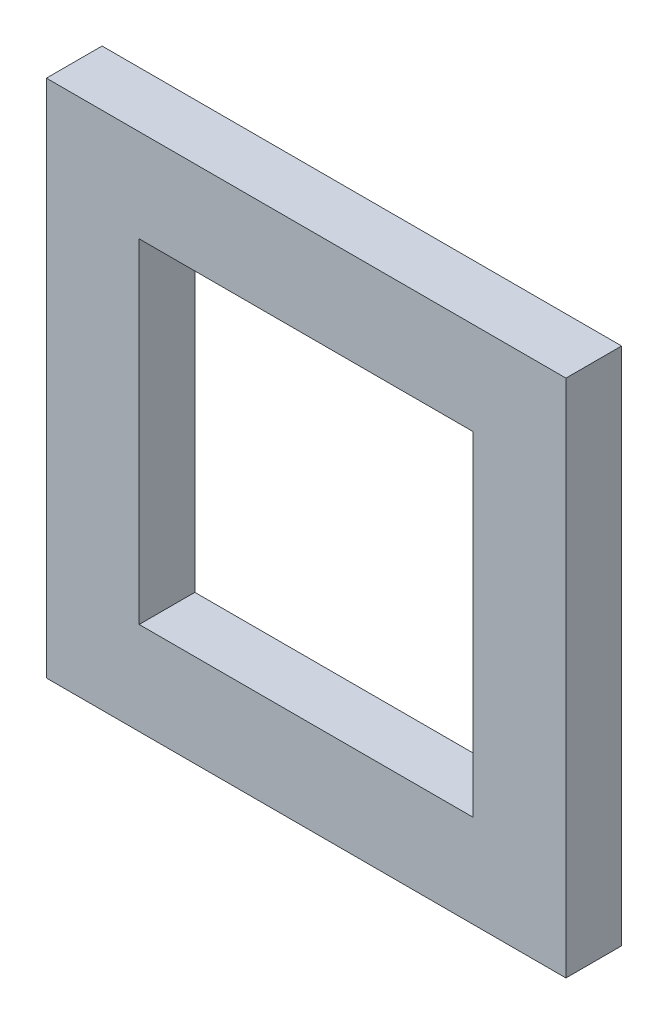
ISO-10303-21;
HEADER;
FILE_DESCRIPTION(('STEP AP214'),'2;1');
FILE_NAME('part.step','',(''),(''),'','','');
FILE_SCHEMA(('AUTOMOTIVE_DESIGN { 1 0 10303 214 1 1 1 1 }'));
ENDSEC;
DATA;
#1=APPLICATION_CONTEXT('core data for automotive mechanical design processes');
#2=APPLICATION_PROTOCOL_DEFINITION('international standard','automotive_design',2000,#1);
#3=PRODUCT_CONTEXT('',#1,'mechanical');
#4=PRODUCT('Part','Part','',(#3));
#5=PRODUCT_RELATED_PRODUCT_CATEGORY('part','',(#4));
#6=PRODUCT_DEFINITION_FORMATION('','',#4);
#7=PRODUCT_DEFINITION_CONTEXT('part definition',#1,'design');
#8=PRODUCT_DEFINITION('design','',#6,#7);
#9=PRODUCT_DEFINITION_SHAPE('','',#8);
#10=(LENGTH_UNIT() NAMED_UNIT(*) SI_UNIT(.MILLI.,.METRE.));
#11=(NAMED_UNIT(*) PLANE_ANGLE_UNIT() SI_UNIT($,.RADIAN.));
#12=(NAMED_UNIT(*) SI_UNIT($,.STERADIAN.) SOLID_ANGLE_UNIT());
#13=UNCERTAINTY_MEASURE_WITH_UNIT(LENGTH_MEASURE(1.E-05),#10,'distance_accuracy_value','');
#14=(GEOMETRIC_REPRESENTATION_CONTEXT(3) GLOBAL_UNCERTAINTY_ASSIGNED_CONTEXT((#13)) GLOBAL_UNIT_ASSIGNED_CONTEXT((#10,
#11,#12)) REPRESENTATION_CONTEXT('',''));
#15=CARTESIAN_POINT('',(0.,0.,0.));
#16=DIRECTION('',(0.,0.,1.));
#17=DIRECTION('',(1.,0.,0.));
#18=AXIS2_PLACEMENT_3D('',#15,#16,#17);
#19=CARTESIAN_POINT('',(0.,0.,3.));
#20=DIRECTION('',(0.,0.,-1.));
#21=DIRECTION('',(-1.,0.,0.));
#22=AXIS2_PLACEMENT_3D('',#19,#20,#21);
#23=PLANE('',#22);
#24=DIRECTION('',(0.,-1.,0.));
#25=VECTOR('',#24,1.);
#26=CARTESIAN_POINT('',(0.,0.,3.));
#27=LINE('',#26,#25);
#28=CARTESIAN_POINT('',(0.,28.,3.));
#29=VERTEX_POINT('',#28);
#30=CARTESIAN_POINT('',(0.,0.,3.));
#31=VERTEX_POINT('',#30);
#32=EDGE_CURVE('E143',#29,#31,#27,.T.);
#33=ORIENTED_EDGE('',*,*,#32,.T.);
#34=DIRECTION('',(1.,0.,0.));
#35=VECTOR('',#34,1.);
#36=CARTESIAN_POINT('',(0.,0.,3.));
#37=LINE('',#36,#35);
#38=CARTESIAN_POINT('',(28.,0.,3.));
#39=VERTEX_POINT('',#38);
#40=EDGE_CURVE('E150',#31,#39,#37,.T.);
#41=ORIENTED_EDGE('',*,*,#40,.T.);
#42=DIRECTION('',(0.,1.,0.));
#43=VECTOR('',#42,1.);
#44=CARTESIAN_POINT('',(28.,0.,3.));
#45=LINE('',#44,#43);
#46=CARTESIAN_POINT('',(28.,28.,3.));
#47=VERTEX_POINT('',#46);
#48=EDGE_CURVE('E148',#39,#47,#45,.T.);
#49=ORIENTED_EDGE('',*,*,#48,.T.);
#50=DIRECTION('',(-1.,0.,0.));
#51=VECTOR('',#50,1.);
#52=CARTESIAN_POINT('',(0.,28.,3.));
#53=LINE('',#52,#51);
#54=EDGE_CURVE('E155',#47,#29,#53,.T.);
#55=ORIENTED_EDGE('',*,*,#54,.T.);
#56=EDGE_LOOP('',(#33,#41,#49,#55));
#57=FACE_BOUND('',#56,.T.);
#58=DIRECTION('',(0.,-1.,0.));
#59=VECTOR('',#58,1.);
#60=CARTESIAN_POINT('',(5.,5.,3.));
#61=LINE('',#60,#59);
#62=CARTESIAN_POINT('',(5.,23.,3.));
#63=VERTEX_POINT('',#62);
#64=CARTESIAN_POINT('',(5.,5.,3.));
#65=VERTEX_POINT('',#64);
#66=EDGE_CURVE('E106',#63,#65,#61,.T.);
#67=ORIENTED_EDGE('',*,*,#66,.F.);
#68=DIRECTION('',(-1.,0.,0.));
#69=VECTOR('',#68,1.);
#70=CARTESIAN_POINT('',(5.,23.,3.));
#71=LINE('',#70,#69);
#72=CARTESIAN_POINT('',(23.,23.,3.));
#73=VERTEX_POINT('',#72);
#74=EDGE_CURVE('E127',#73,#63,#71,.T.);
#75=ORIENTED_EDGE('',*,*,#74,.F.);
#76=DIRECTION('',(0.,1.,0.));
#77=VECTOR('',#76,1.);
#78=CARTESIAN_POINT('',(23.,5.,3.));
#79=LINE('',#78,#77);
#80=CARTESIAN_POINT('',(23.,5.,3.));
#81=VERTEX_POINT('',#80);
#82=EDGE_CURVE('E126',#81,#73,#79,.T.);
#83=ORIENTED_EDGE('',*,*,#82,.F.);
#84=DIRECTION('',(1.,0.,0.));
#85=VECTOR('',#84,1.);
#86=CARTESIAN_POINT('',(5.,5.,3.));
#87=LINE('',#86,#85);
#88=EDGE_CURVE('E118',#65,#81,#87,.T.);
#89=ORIENTED_EDGE('',*,*,#88,.F.);
#90=EDGE_LOOP('',(#67,#75,#83,#89));
#91=FACE_BOUND('',#90,.T.);
#92=ADVANCED_FACE('F43',(#57,#91),#23,.F.);
#93=CARTESIAN_POINT('',(0.,0.,0.));
#94=DIRECTION('',(0.,0.,-1.));
#95=DIRECTION('',(-1.,0.,0.));
#96=AXIS2_PLACEMENT_3D('',#93,#94,#95);
#97=PLANE('',#96);
#98=DIRECTION('',(0.,-1.,0.));
#99=VECTOR('',#98,1.);
#100=CARTESIAN_POINT('',(0.,0.,0.));
#101=LINE('',#100,#99);
#102=CARTESIAN_POINT('',(0.,28.,0.));
#103=VERTEX_POINT('',#102);
#104=CARTESIAN_POINT('',(0.,0.,0.));
#105=VERTEX_POINT('',#104);
#106=EDGE_CURVE('E125',#103,#105,#101,.T.);
#107=ORIENTED_EDGE('',*,*,#106,.F.);
#108=DIRECTION('',(-1.,0.,0.));
#109=VECTOR('',#108,1.);
#110=CARTESIAN_POINT('',(0.,28.,0.));
#111=LINE('',#110,#109);
#112=CARTESIAN_POINT('',(28.,28.,0.));
#113=VERTEX_POINT('',#112);
#114=EDGE_CURVE('E149',#113,#103,#111,.T.);
#115=ORIENTED_EDGE('',*,*,#114,.F.);
#116=DIRECTION('',(0.,1.,0.));
#117=VECTOR('',#116,1.);
#118=CARTESIAN_POINT('',(28.,0.,0.));
#119=LINE('',#118,#117);
#120=CARTESIAN_POINT('',(28.,0.,0.));
#121=VERTEX_POINT('',#120);
#122=EDGE_CURVE('E159',#121,#113,#119,.T.);
#123=ORIENTED_EDGE('',*,*,#122,.F.);
#124=DIRECTION('',(1.,0.,0.));
#125=VECTOR('',#124,1.);
#126=CARTESIAN_POINT('',(0.,0.,0.));
#127=LINE('',#126,#125);
#128=EDGE_CURVE('E160',#105,#121,#127,.T.);
#129=ORIENTED_EDGE('',*,*,#128,.F.);
#130=EDGE_LOOP('',(#107,#115,#123,#129));
#131=FACE_BOUND('',#130,.T.);
#132=DIRECTION('',(-1.,0.,0.));
#133=VECTOR('',#132,1.);
#134=CARTESIAN_POINT('',(5.,23.,0.));
#135=LINE('',#134,#133);
#136=CARTESIAN_POINT('',(23.,23.,0.));
#137=VERTEX_POINT('',#136);
#138=CARTESIAN_POINT('',(5.,23.,0.));
#139=VERTEX_POINT('',#138);
#140=EDGE_CURVE('E120',#137,#139,#135,.T.);
#141=ORIENTED_EDGE('',*,*,#140,.T.);
#142=DIRECTION('',(0.,-1.,0.));
#143=VECTOR('',#142,1.);
#144=CARTESIAN_POINT('',(5.,5.,0.));
#145=LINE('',#144,#143);
#146=CARTESIAN_POINT('',(5.,5.,0.));
#147=VERTEX_POINT('',#146);
#148=EDGE_CURVE('E67',#139,#147,#145,.T.);
#149=ORIENTED_EDGE('',*,*,#148,.T.);
#150=DIRECTION('',(1.,0.,0.));
#151=VECTOR('',#150,1.);
#152=CARTESIAN_POINT('',(5.,5.,0.));
#153=LINE('',#152,#151);
#154=CARTESIAN_POINT('',(23.,5.,0.));
#155=VERTEX_POINT('',#154);
#156=EDGE_CURVE('E121',#147,#155,#153,.T.);
#157=ORIENTED_EDGE('',*,*,#156,.T.);
#158=DIRECTION('',(0.,1.,0.));
#159=VECTOR('',#158,1.);
#160=CARTESIAN_POINT('',(23.,5.,0.));
#161=LINE('',#160,#159);
#162=EDGE_CURVE('E136',#155,#137,#161,.T.);
#163=ORIENTED_EDGE('',*,*,#162,.T.);
#164=EDGE_LOOP('',(#141,#149,#157,#163));
#165=FACE_BOUND('',#164,.T.);
#166=ADVANCED_FACE('F180',(#131,#165),#97,.T.);
#167=CARTESIAN_POINT('',(0.,0.,3.));
#168=DIRECTION('',(1.,0.,0.));
#169=DIRECTION('',(0.,0.,-1.));
#170=AXIS2_PLACEMENT_3D('',#167,#168,#169);
#171=PLANE('',#170);
#172=ORIENTED_EDGE('',*,*,#106,.T.);
#173=DIRECTION('',(0.,0.,-1.));
#174=VECTOR('',#173,1.);
#175=CARTESIAN_POINT('',(0.,0.,3.));
#176=LINE('',#175,#174);
#177=EDGE_CURVE('E11',#31,#105,#176,.T.);
#178=ORIENTED_EDGE('',*,*,#177,.F.);
#179=ORIENTED_EDGE('',*,*,#32,.F.);
#180=DIRECTION('',(0.,0.,-1.));
#181=VECTOR('',#180,1.);
#182=CARTESIAN_POINT('',(0.,28.,3.));
#183=LINE('',#182,#181);
#184=EDGE_CURVE('E152',#29,#103,#183,.T.);
#185=ORIENTED_EDGE('',*,*,#184,.T.);
#186=EDGE_LOOP('',(#172,#178,#179,#185));
#187=FACE_BOUND('',#186,.T.);
#188=ADVANCED_FACE('F44',(#187),#171,.F.);
#189=CARTESIAN_POINT('',(0.,0.,3.));
#190=DIRECTION('',(0.,1.,0.));
#191=DIRECTION('',(0.,0.,1.));
#192=AXIS2_PLACEMENT_3D('',#189,#190,#191);
#193=PLANE('',#192);
#194=ORIENTED_EDGE('',*,*,#128,.T.);
#195=DIRECTION('',(0.,0.,-1.));
#196=VECTOR('',#195,1.);
#197=CARTESIAN_POINT('',(28.,0.,3.));
#198=LINE('',#197,#196);
#199=EDGE_CURVE('E51',#39,#121,#198,.T.);
#200=ORIENTED_EDGE('',*,*,#199,.F.);
#201=ORIENTED_EDGE('',*,*,#40,.F.);
#202=ORIENTED_EDGE('',*,*,#177,.T.);
#203=EDGE_LOOP('',(#194,#200,#201,#202));
#204=FACE_BOUND('',#203,.T.);
#205=ADVANCED_FACE('F190',(#204),#193,.F.);
#206=CARTESIAN_POINT('',(28.,0.,3.));
#207=DIRECTION('',(-1.,0.,0.));
#208=DIRECTION('',(0.,0.,1.));
#209=AXIS2_PLACEMENT_3D('',#206,#207,#208);
#210=PLANE('',#209);
#211=ORIENTED_EDGE('',*,*,#122,.T.);
#212=DIRECTION('',(0.,0.,-1.));
#213=VECTOR('',#212,1.);
#214=CARTESIAN_POINT('',(28.,28.,3.));
#215=LINE('',#214,#213);
#216=EDGE_CURVE('E162',#47,#113,#215,.T.);
#217=ORIENTED_EDGE('',*,*,#216,.F.);
#218=ORIENTED_EDGE('',*,*,#48,.F.);
#219=ORIENTED_EDGE('',*,*,#199,.T.);
#220=EDGE_LOOP('',(#211,#217,#218,#219));
#221=FACE_BOUND('',#220,.T.);
#222=ADVANCED_FACE('F173',(#221),#210,.F.);
#223=CARTESIAN_POINT('',(0.,28.,3.));
#224=DIRECTION('',(0.,-1.,0.));
#225=DIRECTION('',(0.,0.,-1.));
#226=AXIS2_PLACEMENT_3D('',#223,#224,#225);
#227=PLANE('',#226);
#228=ORIENTED_EDGE('',*,*,#114,.T.);
#229=ORIENTED_EDGE('',*,*,#184,.F.);
#230=ORIENTED_EDGE('',*,*,#54,.F.);
#231=ORIENTED_EDGE('',*,*,#216,.T.);
#232=EDGE_LOOP('',(#228,#229,#230,#231));
#233=FACE_BOUND('',#232,.T.);
#234=ADVANCED_FACE('F181',(#233),#227,.F.);
#235=CARTESIAN_POINT('',(5.,5.,3.));
#236=DIRECTION('',(1.,0.,0.));
#237=DIRECTION('',(0.,0.,-1.));
#238=AXIS2_PLACEMENT_3D('',#235,#236,#237);
#239=PLANE('',#238);
#240=ORIENTED_EDGE('',*,*,#148,.F.);
#241=DIRECTION('',(0.,0.,-1.));
#242=VECTOR('',#241,1.);
#243=CARTESIAN_POINT('',(5.,23.,3.));
#244=LINE('',#243,#242);
#245=EDGE_CURVE('E115',#63,#139,#244,.T.);
#246=ORIENTED_EDGE('',*,*,#245,.F.);
#247=ORIENTED_EDGE('',*,*,#66,.T.);
#248=DIRECTION('',(0.,0.,-1.));
#249=VECTOR('',#248,1.);
#250=CARTESIAN_POINT('',(5.,5.,3.));
#251=LINE('',#250,#249);
#252=EDGE_CURVE('E112',#65,#147,#251,.T.);
#253=ORIENTED_EDGE('',*,*,#252,.T.);
#254=EDGE_LOOP('',(#240,#246,#247,#253));
#255=FACE_BOUND('',#254,.T.);
#256=ADVANCED_FACE('F109',(#255),#239,.T.);
#257=CARTESIAN_POINT('',(5.,5.,3.));
#258=DIRECTION('',(0.,1.,0.));
#259=DIRECTION('',(0.,0.,1.));
#260=AXIS2_PLACEMENT_3D('',#257,#258,#259);
#261=PLANE('',#260);
#262=ORIENTED_EDGE('',*,*,#156,.F.);
#263=ORIENTED_EDGE('',*,*,#252,.F.);
#264=ORIENTED_EDGE('',*,*,#88,.T.);
#265=DIRECTION('',(0.,0.,-1.));
#266=VECTOR('',#265,1.);
#267=CARTESIAN_POINT('',(23.,5.,3.));
#268=LINE('',#267,#266);
#269=EDGE_CURVE('E124',#81,#155,#268,.T.);
#270=ORIENTED_EDGE('',*,*,#269,.T.);
#271=EDGE_LOOP('',(#262,#263,#264,#270));
#272=FACE_BOUND('',#271,.T.);
#273=ADVANCED_FACE('F119',(#272),#261,.T.);
#274=CARTESIAN_POINT('',(23.,5.,3.));
#275=DIRECTION('',(-1.,0.,0.));
#276=DIRECTION('',(0.,0.,1.));
#277=AXIS2_PLACEMENT_3D('',#274,#275,#276);
#278=PLANE('',#277);
#279=ORIENTED_EDGE('',*,*,#162,.F.);
#280=ORIENTED_EDGE('',*,*,#269,.F.);
#281=ORIENTED_EDGE('',*,*,#82,.T.);
#282=DIRECTION('',(0.,0.,-1.));
#283=VECTOR('',#282,1.);
#284=CARTESIAN_POINT('',(23.,23.,3.));
#285=LINE('',#284,#283);
#286=EDGE_CURVE('E59',#73,#137,#285,.T.);
#287=ORIENTED_EDGE('',*,*,#286,.T.);
#288=EDGE_LOOP('',(#279,#280,#281,#287));
#289=FACE_BOUND('',#288,.T.);
#290=ADVANCED_FACE('F209',(#289),#278,.T.);
#291=CARTESIAN_POINT('',(5.,23.,3.));
#292=DIRECTION('',(0.,-1.,0.));
#293=DIRECTION('',(0.,0.,-1.));
#294=AXIS2_PLACEMENT_3D('',#291,#292,#293);
#295=PLANE('',#294);
#296=ORIENTED_EDGE('',*,*,#140,.F.);
#297=ORIENTED_EDGE('',*,*,#286,.F.);
#298=ORIENTED_EDGE('',*,*,#74,.T.);
#299=ORIENTED_EDGE('',*,*,#245,.T.);
#300=EDGE_LOOP('',(#296,#297,#298,#299));
#301=FACE_BOUND('',#300,.T.);
#302=ADVANCED_FACE('F215',(#301),#295,.T.);
#303=CLOSED_SHELL('',(#92,#166,#188,#205,#222,#234,#256,#273,#290,#302));
#304=MANIFOLD_SOLID_BREP('B2',#303);
#305=ADVANCED_BREP_SHAPE_REPRESENTATION('',(#18,#304),#14);
#306=SHAPE_DEFINITION_REPRESENTATION(#9,#305);
ENDSEC;
END-ISO-10303-21;
